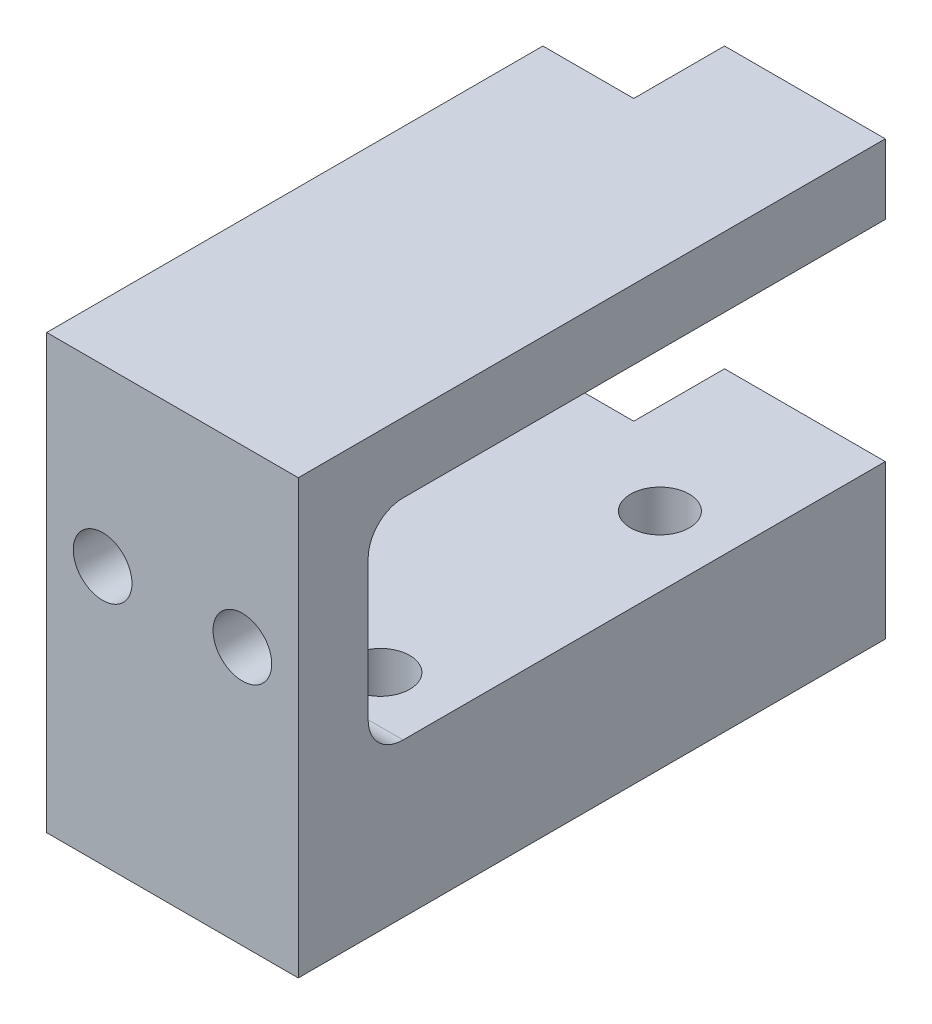
ISO-10303-21;
HEADER;
FILE_DESCRIPTION(('STEP AP214'),'2;1');
FILE_NAME('part.step','',(''),(''),'','','');
FILE_SCHEMA(('AUTOMOTIVE_DESIGN { 1 0 10303 214 1 1 1 1 }'));
ENDSEC;
DATA;
#1=APPLICATION_CONTEXT('core data for automotive mechanical design processes');
#2=APPLICATION_PROTOCOL_DEFINITION('international standard','automotive_design',2000,#1);
#3=PRODUCT_CONTEXT('',#1,'mechanical');
#4=PRODUCT('Part','Part','',(#3));
#5=PRODUCT_RELATED_PRODUCT_CATEGORY('part','',(#4));
#6=PRODUCT_DEFINITION_FORMATION('','',#4);
#7=PRODUCT_DEFINITION_CONTEXT('part definition',#1,'design');
#8=PRODUCT_DEFINITION('design','',#6,#7);
#9=PRODUCT_DEFINITION_SHAPE('','',#8);
#10=(LENGTH_UNIT() NAMED_UNIT(*) SI_UNIT(.MILLI.,.METRE.));
#11=(NAMED_UNIT(*) PLANE_ANGLE_UNIT() SI_UNIT($,.RADIAN.));
#12=(NAMED_UNIT(*) SI_UNIT($,.STERADIAN.) SOLID_ANGLE_UNIT());
#13=UNCERTAINTY_MEASURE_WITH_UNIT(LENGTH_MEASURE(1.E-05),#10,'distance_accuracy_value','');
#14=(GEOMETRIC_REPRESENTATION_CONTEXT(3) GLOBAL_UNCERTAINTY_ASSIGNED_CONTEXT((#13)) GLOBAL_UNIT_ASSIGNED_CONTEXT((#10,
#11,#12)) REPRESENTATION_CONTEXT('',''));
#15=CARTESIAN_POINT('',(0.,0.,0.));
#16=DIRECTION('',(0.,0.,1.));
#17=DIRECTION('',(1.,0.,0.));
#18=AXIS2_PLACEMENT_3D('',#15,#16,#17);
#19=CARTESIAN_POINT('',(0.,0.,-2.5));
#20=DIRECTION('',(0.,0.,-1.));
#21=DIRECTION('',(-1.,0.,0.));
#22=AXIS2_PLACEMENT_3D('',#19,#20,#21);
#23=PLANE('',#22);
#24=CARTESIAN_POINT('',(-5.,2.50000000000033,-2.5));
#25=DIRECTION('',(0.,0.,-1.));
#26=DIRECTION('',(-1.,0.,0.));
#27=AXIS2_PLACEMENT_3D('',#24,#25,#26);
#28=CIRCLE('',#27,2.09999999999999);
#29=CARTESIAN_POINT('',(-7.09999999999999,2.50000000000033,-2.5));
#30=VERTEX_POINT('',#29);
#31=EDGE_CURVE('E310',#30,#30,#28,.T.);
#32=ORIENTED_EDGE('',*,*,#31,.F.);
#33=EDGE_LOOP('',(#32));
#34=FACE_BOUND('',#33,.T.);
#35=CARTESIAN_POINT('',(5.,2.50000000000033,-2.5));
#36=DIRECTION('',(0.,0.,-1.));
#37=DIRECTION('',(-1.,0.,0.));
#38=AXIS2_PLACEMENT_3D('',#35,#36,#37);
#39=CIRCLE('',#38,2.09999999999999);
#40=CARTESIAN_POINT('',(2.90000000000001,2.50000000000033,-2.5));
#41=VERTEX_POINT('',#40);
#42=EDGE_CURVE('E318',#41,#41,#39,.T.);
#43=ORIENTED_EDGE('',*,*,#42,.F.);
#44=EDGE_LOOP('',(#43));
#45=FACE_BOUND('',#44,.T.);
#46=DIRECTION('',(0.,-1.,0.));
#47=VECTOR('',#46,1.);
#48=CARTESIAN_POINT('',(-9.,-10.,-2.5));
#49=LINE('',#48,#47);
#50=CARTESIAN_POINT('',(-9.,7.5,-2.5));
#51=VERTEX_POINT('',#50);
#52=CARTESIAN_POINT('',(-9.,-2.5,-2.5));
#53=VERTEX_POINT('',#52);
#54=EDGE_CURVE('E222',#51,#53,#49,.T.);
#55=ORIENTED_EDGE('',*,*,#54,.F.);
#56=DIRECTION('',(-1.,0.,0.));
#57=VECTOR('',#56,1.);
#58=CARTESIAN_POINT('',(9.,7.5,-2.5));
#59=LINE('',#58,#57);
#60=CARTESIAN_POINT('',(9.,7.5,-2.5));
#61=VERTEX_POINT('',#60);
#62=EDGE_CURVE('E236',#51,#61,#59,.F.);
#63=ORIENTED_EDGE('',*,*,#62,.T.);
#64=DIRECTION('',(0.,1.,0.));
#65=VECTOR('',#64,1.);
#66=CARTESIAN_POINT('',(9.,-10.,-2.5));
#67=LINE('',#66,#65);
#68=CARTESIAN_POINT('',(9.,-2.5,-2.5));
#69=VERTEX_POINT('',#68);
#70=EDGE_CURVE('E217',#69,#61,#67,.T.);
#71=ORIENTED_EDGE('',*,*,#70,.F.);
#72=DIRECTION('',(-1.,0.,0.));
#73=VECTOR('',#72,1.);
#74=CARTESIAN_POINT('',(0.,-2.5,-2.5));
#75=LINE('',#74,#73);
#76=EDGE_CURVE('E233',#69,#53,#75,.T.);
#77=ORIENTED_EDGE('',*,*,#76,.T.);
#78=EDGE_LOOP('',(#55,#63,#71,#77));
#79=FACE_BOUND('',#78,.T.);
#80=ADVANCED_FACE('F45',(#34,#45,#79),#23,.T.);
#81=CARTESIAN_POINT('',(9.,-10.,2.5));
#82=DIRECTION('',(-1.,0.,0.));
#83=DIRECTION('',(0.,0.,1.));
#84=AXIS2_PLACEMENT_3D('',#81,#82,#83);
#85=PLANE('',#84);
#86=DIRECTION('',(0.,1.,0.));
#87=VECTOR('',#86,1.);
#88=CARTESIAN_POINT('',(9.,-10.,2.5));
#89=LINE('',#88,#87);
#90=CARTESIAN_POINT('',(9.,-16.,2.5));
#91=VERTEX_POINT('',#90);
#92=CARTESIAN_POINT('',(9.,15.,2.5));
#93=VERTEX_POINT('',#92);
#94=EDGE_CURVE('E218',#91,#93,#89,.T.);
#95=ORIENTED_EDGE('',*,*,#94,.F.);
#96=DIRECTION('',(0.,0.,1.));
#97=VECTOR('',#96,1.);
#98=CARTESIAN_POINT('',(9.,-16.,2.5));
#99=LINE('',#98,#97);
#100=CARTESIAN_POINT('',(9.,-16.,-39.5));
#101=VERTEX_POINT('',#100);
#102=EDGE_CURVE('E296',#101,#91,#99,.T.);
#103=ORIENTED_EDGE('',*,*,#102,.F.);
#104=DIRECTION('',(0.,-1.,0.));
#105=VECTOR('',#104,1.);
#106=CARTESIAN_POINT('',(9.,-10.,-39.5));
#107=LINE('',#106,#105);
#108=CARTESIAN_POINT('',(9.,-5.,-39.5));
#109=VERTEX_POINT('',#108);
#110=EDGE_CURVE('E209',#109,#101,#107,.T.);
#111=ORIENTED_EDGE('',*,*,#110,.F.);
#112=DIRECTION('',(0.,0.,1.));
#113=VECTOR('',#112,1.);
#114=CARTESIAN_POINT('',(9.,-5.,-39.5));
#115=LINE('',#114,#113);
#116=CARTESIAN_POINT('',(9.,-5.,-5.00000000000001));
#117=VERTEX_POINT('',#116);
#118=EDGE_CURVE('E212',#109,#117,#115,.T.);
#119=ORIENTED_EDGE('',*,*,#118,.T.);
#120=CARTESIAN_POINT('',(9.,-2.5,-5.));
#121=DIRECTION('',(-1.,0.,0.));
#122=DIRECTION('',(0.,0.,1.));
#123=AXIS2_PLACEMENT_3D('',#120,#121,#122);
#124=CIRCLE('',#123,2.5);
#125=EDGE_CURVE('E11',#117,#69,#124,.T.);
#126=ORIENTED_EDGE('',*,*,#125,.T.);
#127=ORIENTED_EDGE('',*,*,#70,.T.);
#128=CARTESIAN_POINT('',(9.,7.5,-5.));
#129=DIRECTION('',(-1.,0.,0.));
#130=DIRECTION('',(0.,0.,1.));
#131=AXIS2_PLACEMENT_3D('',#128,#129,#130);
#132=CIRCLE('',#131,2.5);
#133=CARTESIAN_POINT('',(9.,10.,-5.));
#134=VERTEX_POINT('',#133);
#135=EDGE_CURVE('E243',#61,#134,#132,.T.);
#136=ORIENTED_EDGE('',*,*,#135,.T.);
#137=DIRECTION('',(0.,0.,1.));
#138=VECTOR('',#137,1.);
#139=CARTESIAN_POINT('',(9.,10.,-58.1815416922694));
#140=LINE('',#139,#138);
#141=CARTESIAN_POINT('',(9.,10.,-39.5));
#142=VERTEX_POINT('',#141);
#143=EDGE_CURVE('E199',#142,#134,#140,.T.);
#144=ORIENTED_EDGE('',*,*,#143,.F.);
#145=DIRECTION('',(0.,1.,0.));
#146=VECTOR('',#145,1.);
#147=CARTESIAN_POINT('',(9.,10.,-39.5));
#148=LINE('',#147,#146);
#149=CARTESIAN_POINT('',(9.,15.,-39.5));
#150=VERTEX_POINT('',#149);
#151=EDGE_CURVE('E193',#142,#150,#148,.T.);
#152=ORIENTED_EDGE('',*,*,#151,.T.);
#153=DIRECTION('',(0.,0.,1.));
#154=VECTOR('',#153,1.);
#155=CARTESIAN_POINT('',(9.,15.,-58.1815416922694));
#156=LINE('',#155,#154);
#157=EDGE_CURVE('E183',#150,#93,#156,.T.);
#158=ORIENTED_EDGE('',*,*,#157,.T.);
#159=EDGE_LOOP('',(#95,#103,#111,#119,#126,#127,#136,#144,#152,#158));
#160=FACE_BOUND('',#159,.T.);
#161=ADVANCED_FACE('F249',(#160),#85,.F.);
#162=CARTESIAN_POINT('',(-9.,-10.,2.5));
#163=DIRECTION('',(1.,0.,0.));
#164=DIRECTION('',(0.,0.,-1.));
#165=AXIS2_PLACEMENT_3D('',#162,#163,#164);
#166=PLANE('',#165);
#167=DIRECTION('',(0.,0.,1.));
#168=VECTOR('',#167,1.);
#169=CARTESIAN_POINT('',(-9.,15.,-58.1815416922694));
#170=LINE('',#169,#168);
#171=CARTESIAN_POINT('',(-9.,15.,-33.));
#172=VERTEX_POINT('',#171);
#173=CARTESIAN_POINT('',(-9.,15.,2.5));
#174=VERTEX_POINT('',#173);
#175=EDGE_CURVE('E186',#172,#174,#170,.T.);
#176=ORIENTED_EDGE('',*,*,#175,.F.);
#177=DIRECTION('',(0.,-1.,0.));
#178=VECTOR('',#177,1.);
#179=CARTESIAN_POINT('',(-9.,15.,-33.));
#180=LINE('',#179,#178);
#181=CARTESIAN_POINT('',(-9.,10.,-33.));
#182=VERTEX_POINT('',#181);
#183=EDGE_CURVE('E288',#172,#182,#180,.T.);
#184=ORIENTED_EDGE('',*,*,#183,.T.);
#185=DIRECTION('',(0.,0.,1.));
#186=VECTOR('',#185,1.);
#187=CARTESIAN_POINT('',(-9.,10.,-58.1815416922694));
#188=LINE('',#187,#186);
#189=CARTESIAN_POINT('',(-9.,10.,-5.));
#190=VERTEX_POINT('',#189);
#191=EDGE_CURVE('E191',#182,#190,#188,.T.);
#192=ORIENTED_EDGE('',*,*,#191,.T.);
#193=CARTESIAN_POINT('',(-9.,7.5,-5.));
#194=DIRECTION('',(1.,0.,0.));
#195=DIRECTION('',(0.,0.,-1.));
#196=AXIS2_PLACEMENT_3D('',#193,#194,#195);
#197=CIRCLE('',#196,2.5);
#198=EDGE_CURVE('E240',#190,#51,#197,.T.);
#199=ORIENTED_EDGE('',*,*,#198,.T.);
#200=ORIENTED_EDGE('',*,*,#54,.T.);
#201=CARTESIAN_POINT('',(-9.,-2.5,-5.));
#202=DIRECTION('',(1.,0.,0.));
#203=DIRECTION('',(0.,0.,-1.));
#204=AXIS2_PLACEMENT_3D('',#201,#202,#203);
#205=CIRCLE('',#204,2.5);
#206=CARTESIAN_POINT('',(-9.,-5.,-5.00000000000001));
#207=VERTEX_POINT('',#206);
#208=EDGE_CURVE('E53',#53,#207,#205,.T.);
#209=ORIENTED_EDGE('',*,*,#208,.T.);
#210=DIRECTION('',(0.,0.,1.));
#211=VECTOR('',#210,1.);
#212=CARTESIAN_POINT('',(-9.,-5.,-39.5));
#213=LINE('',#212,#211);
#214=CARTESIAN_POINT('',(-9.,-5.,-33.));
#215=VERTEX_POINT('',#214);
#216=EDGE_CURVE('E214',#215,#207,#213,.T.);
#217=ORIENTED_EDGE('',*,*,#216,.F.);
#218=CARTESIAN_POINT('',(-9.,-16.,-33.));
#219=VERTEX_POINT('',#218);
#220=EDGE_CURVE('E329',#215,#219,#180,.T.);
#221=ORIENTED_EDGE('',*,*,#220,.T.);
#222=DIRECTION('',(0.,0.,-1.));
#223=VECTOR('',#222,1.);
#224=CARTESIAN_POINT('',(-9.,-16.,2.5));
#225=LINE('',#224,#223);
#226=CARTESIAN_POINT('',(-9.,-16.,2.5));
#227=VERTEX_POINT('',#226);
#228=EDGE_CURVE('E302',#227,#219,#225,.T.);
#229=ORIENTED_EDGE('',*,*,#228,.F.);
#230=DIRECTION('',(0.,-1.,0.));
#231=VECTOR('',#230,1.);
#232=CARTESIAN_POINT('',(-9.,-10.,2.5));
#233=LINE('',#232,#231);
#234=EDGE_CURVE('E221',#174,#227,#233,.T.);
#235=ORIENTED_EDGE('',*,*,#234,.F.);
#236=EDGE_LOOP('',(#176,#184,#192,#199,#200,#209,#217,#221,#229,#235));
#237=FACE_BOUND('',#236,.T.);
#238=ADVANCED_FACE('F260',(#237),#166,.F.);
#239=CARTESIAN_POINT('',(0.,0.,2.5));
#240=DIRECTION('',(0.,0.,-1.));
#241=DIRECTION('',(-1.,0.,0.));
#242=AXIS2_PLACEMENT_3D('',#239,#240,#241);
#243=PLANE('',#242);
#244=CARTESIAN_POINT('',(-5.,2.50000000000033,2.5));
#245=DIRECTION('',(0.,0.,1.));
#246=DIRECTION('',(1.,0.,0.));
#247=AXIS2_PLACEMENT_3D('',#244,#245,#246);
#248=CIRCLE('',#247,2.1);
#249=CARTESIAN_POINT('',(-2.9,2.50000000000033,2.5));
#250=VERTEX_POINT('',#249);
#251=EDGE_CURVE('E306',#250,#250,#248,.T.);
#252=ORIENTED_EDGE('',*,*,#251,.F.);
#253=EDGE_LOOP('',(#252));
#254=FACE_BOUND('',#253,.T.);
#255=CARTESIAN_POINT('',(5.,2.50000000000033,2.5));
#256=DIRECTION('',(0.,0.,1.));
#257=DIRECTION('',(1.,0.,0.));
#258=AXIS2_PLACEMENT_3D('',#255,#256,#257);
#259=CIRCLE('',#258,2.1);
#260=CARTESIAN_POINT('',(7.1,2.50000000000033,2.5));
#261=VERTEX_POINT('',#260);
#262=EDGE_CURVE('E314',#261,#261,#259,.T.);
#263=ORIENTED_EDGE('',*,*,#262,.F.);
#264=EDGE_LOOP('',(#263));
#265=FACE_BOUND('',#264,.T.);
#266=ORIENTED_EDGE('',*,*,#94,.T.);
#267=DIRECTION('',(-1.,0.,0.));
#268=VECTOR('',#267,1.);
#269=CARTESIAN_POINT('',(-9.,15.,2.5));
#270=LINE('',#269,#268);
#271=EDGE_CURVE('E320',#93,#174,#270,.T.);
#272=ORIENTED_EDGE('',*,*,#271,.T.);
#273=ORIENTED_EDGE('',*,*,#234,.T.);
#274=DIRECTION('',(-1.,0.,0.));
#275=VECTOR('',#274,1.);
#276=CARTESIAN_POINT('',(9.,-16.,2.5));
#277=LINE('',#276,#275);
#278=EDGE_CURVE('E299',#91,#227,#277,.T.);
#279=ORIENTED_EDGE('',*,*,#278,.F.);
#280=EDGE_LOOP('',(#266,#272,#273,#279));
#281=FACE_BOUND('',#280,.T.);
#282=ADVANCED_FACE('F324',(#254,#265,#281),#243,.F.);
#283=CARTESIAN_POINT('',(-9.,-5.,-39.5));
#284=DIRECTION('',(0.,-1.,0.));
#285=DIRECTION('',(1.,0.,0.));
#286=AXIS2_PLACEMENT_3D('',#283,#284,#285);
#287=PLANE('',#286);
#288=CARTESIAN_POINT('',(4.,-5.,-28.375));
#289=DIRECTION('',(0.,-1.,0.));
#290=DIRECTION('',(1.,0.,0.));
#291=AXIS2_PLACEMENT_3D('',#288,#289,#290);
#292=CIRCLE('',#291,2.1);
#293=CARTESIAN_POINT('',(6.1,-5.,-28.375));
#294=VERTEX_POINT('',#293);
#295=EDGE_CURVE('E600',#294,#294,#292,.T.);
#296=ORIENTED_EDGE('',*,*,#295,.T.);
#297=EDGE_LOOP('',(#296));
#298=FACE_BOUND('',#297,.T.);
#299=CARTESIAN_POINT('',(4.,-5.,-8.375));
#300=DIRECTION('',(0.,-1.,0.));
#301=DIRECTION('',(1.,0.,0.));
#302=AXIS2_PLACEMENT_3D('',#299,#300,#301);
#303=CIRCLE('',#302,2.1);
#304=CARTESIAN_POINT('',(6.09999999999999,-5.,-8.375));
#305=VERTEX_POINT('',#304);
#306=EDGE_CURVE('E335',#305,#305,#303,.T.);
#307=ORIENTED_EDGE('',*,*,#306,.T.);
#308=EDGE_LOOP('',(#307));
#309=FACE_BOUND('',#308,.T.);
#310=ORIENTED_EDGE('',*,*,#216,.T.);
#311=DIRECTION('',(-1.,0.,0.));
#312=VECTOR('',#311,1.);
#313=CARTESIAN_POINT('',(-9.,-5.,-5.));
#314=LINE('',#313,#312);
#315=EDGE_CURVE('E60',#207,#117,#314,.F.);
#316=ORIENTED_EDGE('',*,*,#315,.T.);
#317=ORIENTED_EDGE('',*,*,#118,.F.);
#318=DIRECTION('',(1.,0.,0.));
#319=VECTOR('',#318,1.);
#320=CARTESIAN_POINT('',(-9.,-5.,-39.5));
#321=LINE('',#320,#319);
#322=CARTESIAN_POINT('',(-2.5,-5.,-39.5));
#323=VERTEX_POINT('',#322);
#324=EDGE_CURVE('E207',#323,#109,#321,.T.);
#325=ORIENTED_EDGE('',*,*,#324,.F.);
#326=DIRECTION('',(0.,0.,1.));
#327=VECTOR('',#326,1.);
#328=CARTESIAN_POINT('',(-2.5,-5.,-39.5));
#329=LINE('',#328,#327);
#330=CARTESIAN_POINT('',(-2.5,-5.,-33.));
#331=VERTEX_POINT('',#330);
#332=EDGE_CURVE('E272',#323,#331,#329,.T.);
#333=ORIENTED_EDGE('',*,*,#332,.T.);
#334=DIRECTION('',(-1.,0.,0.));
#335=VECTOR('',#334,1.);
#336=CARTESIAN_POINT('',(-9.,-5.,-33.));
#337=LINE('',#336,#335);
#338=EDGE_CURVE('E293',#331,#215,#337,.T.);
#339=ORIENTED_EDGE('',*,*,#338,.T.);
#340=EDGE_LOOP('',(#310,#316,#317,#325,#333,#339));
#341=FACE_BOUND('',#340,.T.);
#342=ADVANCED_FACE('F269',(#298,#309,#341),#287,.F.);
#343=CARTESIAN_POINT('',(0.,0.,-39.5));
#344=DIRECTION('',(0.,0.,-1.));
#345=DIRECTION('',(-1.,0.,0.));
#346=AXIS2_PLACEMENT_3D('',#343,#344,#345);
#347=PLANE('',#346);
#348=DIRECTION('',(0.,-1.,0.));
#349=VECTOR('',#348,1.);
#350=CARTESIAN_POINT('',(-2.5,15.,-39.5));
#351=LINE('',#350,#349);
#352=CARTESIAN_POINT('',(-2.5,-16.,-39.5));
#353=VERTEX_POINT('',#352);
#354=EDGE_CURVE('E178',#323,#353,#351,.T.);
#355=ORIENTED_EDGE('',*,*,#354,.F.);
#356=ORIENTED_EDGE('',*,*,#324,.T.);
#357=ORIENTED_EDGE('',*,*,#110,.T.);
#358=DIRECTION('',(1.,0.,0.));
#359=VECTOR('',#358,1.);
#360=CARTESIAN_POINT('',(9.,-16.,-39.5));
#361=LINE('',#360,#359);
#362=EDGE_CURVE('E277',#353,#101,#361,.T.);
#363=ORIENTED_EDGE('',*,*,#362,.F.);
#364=EDGE_LOOP('',(#355,#356,#357,#363));
#365=FACE_BOUND('',#364,.T.);
#366=ADVANCED_FACE('F275',(#365),#347,.T.);
#367=CARTESIAN_POINT('',(0.,0.,-39.5));
#368=DIRECTION('',(0.,0.,-1.));
#369=DIRECTION('',(-1.,0.,0.));
#370=AXIS2_PLACEMENT_3D('',#367,#368,#369);
#371=PLANE('',#370);
#372=CARTESIAN_POINT('',(-2.5,15.,-39.5));
#373=VERTEX_POINT('',#372);
#374=CARTESIAN_POINT('',(-2.5,10.,-39.5));
#375=VERTEX_POINT('',#374);
#376=EDGE_CURVE('E159',#373,#375,#351,.T.);
#377=ORIENTED_EDGE('',*,*,#376,.F.);
#378=DIRECTION('',(-1.,0.,0.));
#379=VECTOR('',#378,1.);
#380=CARTESIAN_POINT('',(-9.,15.,-39.5));
#381=LINE('',#380,#379);
#382=EDGE_CURVE('E173',#150,#373,#381,.T.);
#383=ORIENTED_EDGE('',*,*,#382,.F.);
#384=ORIENTED_EDGE('',*,*,#151,.F.);
#385=DIRECTION('',(1.,0.,0.));
#386=VECTOR('',#385,1.);
#387=CARTESIAN_POINT('',(-9.,10.,-39.5));
#388=LINE('',#387,#386);
#389=EDGE_CURVE('E175',#375,#142,#388,.T.);
#390=ORIENTED_EDGE('',*,*,#389,.F.);
#391=EDGE_LOOP('',(#377,#383,#384,#390));
#392=FACE_BOUND('',#391,.T.);
#393=ADVANCED_FACE('F171',(#392),#371,.T.);
#394=CARTESIAN_POINT('',(-9.,10.,-58.1815416922694));
#395=DIRECTION('',(0.,-1.,0.));
#396=DIRECTION('',(0.,0.,-1.));
#397=AXIS2_PLACEMENT_3D('',#394,#395,#396);
#398=PLANE('',#397);
#399=ORIENTED_EDGE('',*,*,#143,.T.);
#400=DIRECTION('',(-1.,0.,0.));
#401=VECTOR('',#400,1.);
#402=CARTESIAN_POINT('',(-9.,10.,-5.));
#403=LINE('',#402,#401);
#404=EDGE_CURVE('E224',#134,#190,#403,.T.);
#405=ORIENTED_EDGE('',*,*,#404,.T.);
#406=ORIENTED_EDGE('',*,*,#191,.F.);
#407=DIRECTION('',(-1.,0.,0.));
#408=VECTOR('',#407,1.);
#409=CARTESIAN_POINT('',(-9.,10.,-33.));
#410=LINE('',#409,#408);
#411=CARTESIAN_POINT('',(-2.5,10.,-33.));
#412=VERTEX_POINT('',#411);
#413=EDGE_CURVE('E290',#412,#182,#410,.T.);
#414=ORIENTED_EDGE('',*,*,#413,.F.);
#415=DIRECTION('',(0.,0.,1.));
#416=VECTOR('',#415,1.);
#417=CARTESIAN_POINT('',(-2.5,10.,-58.1815416922694));
#418=LINE('',#417,#416);
#419=EDGE_CURVE('E285',#375,#412,#418,.T.);
#420=ORIENTED_EDGE('',*,*,#419,.F.);
#421=ORIENTED_EDGE('',*,*,#389,.T.);
#422=EDGE_LOOP('',(#399,#405,#406,#414,#420,#421));
#423=FACE_BOUND('',#422,.T.);
#424=ADVANCED_FACE('F255',(#423),#398,.T.);
#425=CARTESIAN_POINT('',(-9.,15.,-58.1815416922694));
#426=DIRECTION('',(0.,1.,0.));
#427=DIRECTION('',(0.,0.,1.));
#428=AXIS2_PLACEMENT_3D('',#425,#426,#427);
#429=PLANE('',#428);
#430=DIRECTION('',(-1.,0.,0.));
#431=VECTOR('',#430,1.);
#432=CARTESIAN_POINT('',(-9.,15.,-33.));
#433=LINE('',#432,#431);
#434=CARTESIAN_POINT('',(-2.5,15.,-33.));
#435=VERTEX_POINT('',#434);
#436=EDGE_CURVE('E166',#435,#172,#433,.T.);
#437=ORIENTED_EDGE('',*,*,#436,.T.);
#438=ORIENTED_EDGE('',*,*,#175,.T.);
#439=ORIENTED_EDGE('',*,*,#271,.F.);
#440=ORIENTED_EDGE('',*,*,#157,.F.);
#441=ORIENTED_EDGE('',*,*,#382,.T.);
#442=DIRECTION('',(0.,0.,1.));
#443=VECTOR('',#442,1.);
#444=CARTESIAN_POINT('',(-2.5,15.,-39.5));
#445=LINE('',#444,#443);
#446=EDGE_CURVE('E156',#373,#435,#445,.T.);
#447=ORIENTED_EDGE('',*,*,#446,.T.);
#448=EDGE_LOOP('',(#437,#438,#439,#440,#441,#447));
#449=FACE_BOUND('',#448,.T.);
#450=ADVANCED_FACE('F180',(#449),#429,.T.);
#451=CARTESIAN_POINT('',(5.,2.50000000000033,2.5));
#452=DIRECTION('',(0.,0.,1.));
#453=DIRECTION('',(1.,0.,0.));
#454=AXIS2_PLACEMENT_3D('',#451,#452,#453);
#455=CYLINDRICAL_SURFACE('',#454,2.09999999999999);
#456=ORIENTED_EDGE('',*,*,#42,.T.);
#457=EDGE_LOOP('',(#456));
#458=FACE_BOUND('',#457,.T.);
#459=ORIENTED_EDGE('',*,*,#262,.T.);
#460=EDGE_LOOP('',(#459));
#461=FACE_BOUND('',#460,.T.);
#462=ADVANCED_FACE('F493',(#458,#461),#455,.F.);
#463=CARTESIAN_POINT('',(-5.,2.50000000000033,2.5));
#464=DIRECTION('',(0.,0.,1.));
#465=DIRECTION('',(1.,0.,0.));
#466=AXIS2_PLACEMENT_3D('',#463,#464,#465);
#467=CYLINDRICAL_SURFACE('',#466,2.09999999999999);
#468=ORIENTED_EDGE('',*,*,#31,.T.);
#469=EDGE_LOOP('',(#468));
#470=FACE_BOUND('',#469,.T.);
#471=ORIENTED_EDGE('',*,*,#251,.T.);
#472=EDGE_LOOP('',(#471));
#473=FACE_BOUND('',#472,.T.);
#474=ADVANCED_FACE('F356',(#470,#473),#467,.F.);
#475=CARTESIAN_POINT('',(0.,-16.,0.));
#476=DIRECTION('',(0.,1.,0.));
#477=DIRECTION('',(0.,0.,1.));
#478=AXIS2_PLACEMENT_3D('',#475,#476,#477);
#479=PLANE('',#478);
#480=CARTESIAN_POINT('',(-4.,-16.,-8.375));
#481=DIRECTION('',(0.,-1.,0.));
#482=DIRECTION('',(0.,0.,-1.));
#483=AXIS2_PLACEMENT_3D('',#480,#481,#482);
#484=CIRCLE('',#483,2.);
#485=CARTESIAN_POINT('',(-4.,-16.,-10.375));
#486=VERTEX_POINT('',#485);
#487=EDGE_CURVE('E613',#486,#486,#484,.T.);
#488=ORIENTED_EDGE('',*,*,#487,.F.);
#489=EDGE_LOOP('',(#488));
#490=FACE_BOUND('',#489,.T.);
#491=CARTESIAN_POINT('',(4.,-16.,-28.375));
#492=DIRECTION('',(0.,-1.,0.));
#493=DIRECTION('',(0.,0.,-1.));
#494=AXIS2_PLACEMENT_3D('',#491,#492,#493);
#495=CIRCLE('',#494,2.1);
#496=CARTESIAN_POINT('',(4.,-16.,-30.475));
#497=VERTEX_POINT('',#496);
#498=EDGE_CURVE('E607',#497,#497,#495,.T.);
#499=ORIENTED_EDGE('',*,*,#498,.F.);
#500=EDGE_LOOP('',(#499));
#501=FACE_BOUND('',#500,.T.);
#502=CARTESIAN_POINT('',(4.,-16.,-8.375));
#503=DIRECTION('',(0.,-1.,0.));
#504=DIRECTION('',(0.,0.,-1.));
#505=AXIS2_PLACEMENT_3D('',#502,#503,#504);
#506=CIRCLE('',#505,2.1);
#507=CARTESIAN_POINT('',(4.,-16.,-10.475));
#508=VERTEX_POINT('',#507);
#509=EDGE_CURVE('E339',#508,#508,#506,.T.);
#510=ORIENTED_EDGE('',*,*,#509,.F.);
#511=EDGE_LOOP('',(#510));
#512=FACE_BOUND('',#511,.T.);
#513=ORIENTED_EDGE('',*,*,#228,.T.);
#514=DIRECTION('',(-1.,0.,0.));
#515=VECTOR('',#514,1.);
#516=CARTESIAN_POINT('',(-9.,-16.,-33.));
#517=LINE('',#516,#515);
#518=CARTESIAN_POINT('',(-2.5,-16.,-33.));
#519=VERTEX_POINT('',#518);
#520=EDGE_CURVE('E167',#519,#219,#517,.T.);
#521=ORIENTED_EDGE('',*,*,#520,.F.);
#522=DIRECTION('',(0.,0.,1.));
#523=VECTOR('',#522,1.);
#524=CARTESIAN_POINT('',(-2.5,-16.,-39.5));
#525=LINE('',#524,#523);
#526=EDGE_CURVE('E333',#353,#519,#525,.T.);
#527=ORIENTED_EDGE('',*,*,#526,.F.);
#528=ORIENTED_EDGE('',*,*,#362,.T.);
#529=ORIENTED_EDGE('',*,*,#102,.T.);
#530=ORIENTED_EDGE('',*,*,#278,.T.);
#531=EDGE_LOOP('',(#513,#521,#527,#528,#529,#530));
#532=FACE_BOUND('',#531,.T.);
#533=ADVANCED_FACE('F332',(#490,#501,#512,#532),#479,.F.);
#534=CARTESIAN_POINT('',(-2.5,15.,-39.5));
#535=DIRECTION('',(1.,0.,0.));
#536=DIRECTION('',(0.,0.,-1.));
#537=AXIS2_PLACEMENT_3D('',#534,#535,#536);
#538=PLANE('',#537);
#539=ORIENTED_EDGE('',*,*,#354,.T.);
#540=ORIENTED_EDGE('',*,*,#526,.T.);
#541=DIRECTION('',(0.,-1.,0.));
#542=VECTOR('',#541,1.);
#543=CARTESIAN_POINT('',(-2.5,15.,-33.));
#544=LINE('',#543,#542);
#545=EDGE_CURVE('E177',#331,#519,#544,.T.);
#546=ORIENTED_EDGE('',*,*,#545,.F.);
#547=ORIENTED_EDGE('',*,*,#332,.F.);
#548=EDGE_LOOP('',(#539,#540,#546,#547));
#549=FACE_BOUND('',#548,.T.);
#550=ADVANCED_FACE('F347',(#549),#538,.F.);
#551=CARTESIAN_POINT('',(-9.,15.,-33.));
#552=DIRECTION('',(0.,0.,1.));
#553=DIRECTION('',(1.,0.,0.));
#554=AXIS2_PLACEMENT_3D('',#551,#552,#553);
#555=PLANE('',#554);
#556=ORIENTED_EDGE('',*,*,#545,.T.);
#557=ORIENTED_EDGE('',*,*,#520,.T.);
#558=ORIENTED_EDGE('',*,*,#220,.F.);
#559=ORIENTED_EDGE('',*,*,#338,.F.);
#560=EDGE_LOOP('',(#556,#557,#558,#559));
#561=FACE_BOUND('',#560,.T.);
#562=ADVANCED_FACE('F346',(#561),#555,.F.);
#563=ORIENTED_EDGE('',*,*,#413,.T.);
#564=ORIENTED_EDGE('',*,*,#183,.F.);
#565=ORIENTED_EDGE('',*,*,#436,.F.);
#566=EDGE_CURVE('E162',#435,#412,#544,.T.);
#567=ORIENTED_EDGE('',*,*,#566,.T.);
#568=EDGE_LOOP('',(#563,#564,#565,#567));
#569=FACE_BOUND('',#568,.T.);
#570=ADVANCED_FACE('F354',(#569),#555,.F.);
#571=ORIENTED_EDGE('',*,*,#419,.T.);
#572=ORIENTED_EDGE('',*,*,#566,.F.);
#573=ORIENTED_EDGE('',*,*,#446,.F.);
#574=ORIENTED_EDGE('',*,*,#376,.T.);
#575=EDGE_LOOP('',(#571,#572,#573,#574));
#576=FACE_BOUND('',#575,.T.);
#577=ADVANCED_FACE('F158',(#576),#538,.F.);
#578=CARTESIAN_POINT('',(4.,-16.,-8.375));
#579=DIRECTION('',(0.,-1.,0.));
#580=DIRECTION('',(0.,0.,-1.));
#581=AXIS2_PLACEMENT_3D('',#578,#579,#580);
#582=CYLINDRICAL_SURFACE('',#581,2.1);
#583=ORIENTED_EDGE('',*,*,#306,.F.);
#584=EDGE_LOOP('',(#583));
#585=FACE_BOUND('',#584,.T.);
#586=ORIENTED_EDGE('',*,*,#509,.T.);
#587=EDGE_LOOP('',(#586));
#588=FACE_BOUND('',#587,.T.);
#589=ADVANCED_FACE('F360',(#585,#588),#582,.F.);
#590=CARTESIAN_POINT('',(4.,-16.,-28.375));
#591=DIRECTION('',(0.,-1.,0.));
#592=DIRECTION('',(0.,0.,-1.));
#593=AXIS2_PLACEMENT_3D('',#590,#591,#592);
#594=CYLINDRICAL_SURFACE('',#593,2.1);
#595=ORIENTED_EDGE('',*,*,#295,.F.);
#596=EDGE_LOOP('',(#595));
#597=FACE_BOUND('',#596,.T.);
#598=ORIENTED_EDGE('',*,*,#498,.T.);
#599=EDGE_LOOP('',(#598));
#600=FACE_BOUND('',#599,.T.);
#601=ADVANCED_FACE('F386',(#597,#600),#594,.F.);
#602=CARTESIAN_POINT('',(-4.,-10.,-8.375));
#603=DIRECTION('',(0.,-1.,0.));
#604=DIRECTION('',(0.,0.,-1.));
#605=AXIS2_PLACEMENT_3D('',#602,#603,#604);
#606=CYLINDRICAL_SURFACE('',#605,2.);
#607=CARTESIAN_POINT('',(-4.,-10.,-8.375));
#608=DIRECTION('',(0.,-1.,0.));
#609=DIRECTION('',(0.,0.,-1.));
#610=AXIS2_PLACEMENT_3D('',#607,#608,#609);
#611=CIRCLE('',#610,2.);
#612=CARTESIAN_POINT('',(-4.,-10.,-10.375));
#613=VERTEX_POINT('',#612);
#614=EDGE_CURVE('E612',#613,#613,#611,.T.);
#615=ORIENTED_EDGE('',*,*,#614,.F.);
#616=EDGE_LOOP('',(#615));
#617=FACE_BOUND('',#616,.T.);
#618=ORIENTED_EDGE('',*,*,#487,.T.);
#619=EDGE_LOOP('',(#618));
#620=FACE_BOUND('',#619,.T.);
#621=ADVANCED_FACE('F380',(#617,#620),#606,.F.);
#622=CARTESIAN_POINT('',(-4.,-10.,-8.375));
#623=DIRECTION('',(0.,-1.,0.));
#624=DIRECTION('',(0.,0.,-1.));
#625=AXIS2_PLACEMENT_3D('',#622,#623,#624);
#626=PLANE('',#625);
#627=ORIENTED_EDGE('',*,*,#614,.T.);
#628=EDGE_LOOP('',(#627));
#629=FACE_BOUND('',#628,.T.);
#630=ADVANCED_FACE('F375',(#629),#626,.T.);
#631=CARTESIAN_POINT('',(-9.,7.5,-5.));
#632=DIRECTION('',(1.,0.,0.));
#633=DIRECTION('',(0.,0.,-1.));
#634=AXIS2_PLACEMENT_3D('',#631,#632,#633);
#635=CYLINDRICAL_SURFACE('',#634,2.5);
#636=ORIENTED_EDGE('',*,*,#135,.F.);
#637=ORIENTED_EDGE('',*,*,#62,.F.);
#638=ORIENTED_EDGE('',*,*,#198,.F.);
#639=ORIENTED_EDGE('',*,*,#404,.F.);
#640=EDGE_LOOP('',(#636,#637,#638,#639));
#641=FACE_BOUND('',#640,.T.);
#642=ADVANCED_FACE('F257',(#641),#635,.F.);
#643=CARTESIAN_POINT('',(0.,-2.5,-5.));
#644=DIRECTION('',(-1.,0.,0.));
#645=DIRECTION('',(0.,-1.,0.));
#646=AXIS2_PLACEMENT_3D('',#643,#644,#645);
#647=CYLINDRICAL_SURFACE('',#646,2.5);
#648=ORIENTED_EDGE('',*,*,#125,.F.);
#649=ORIENTED_EDGE('',*,*,#315,.F.);
#650=ORIENTED_EDGE('',*,*,#208,.F.);
#651=ORIENTED_EDGE('',*,*,#76,.F.);
#652=EDGE_LOOP('',(#648,#649,#650,#651));
#653=FACE_BOUND('',#652,.T.);
#654=ADVANCED_FACE('F47',(#653),#647,.F.);
#655=CLOSED_SHELL('',(#80,#161,#238,#282,#342,#366,#393,#424,#450,#462,#474,#533,#550,#562,#570,
#577,#589,#601,#621,#630,#642,#654));
#656=MANIFOLD_SOLID_BREP('B2',#655);
#657=ADVANCED_BREP_SHAPE_REPRESENTATION('',(#18,#656),#14);
#658=SHAPE_DEFINITION_REPRESENTATION(#9,#657);
ENDSEC;
END-ISO-10303-21;
